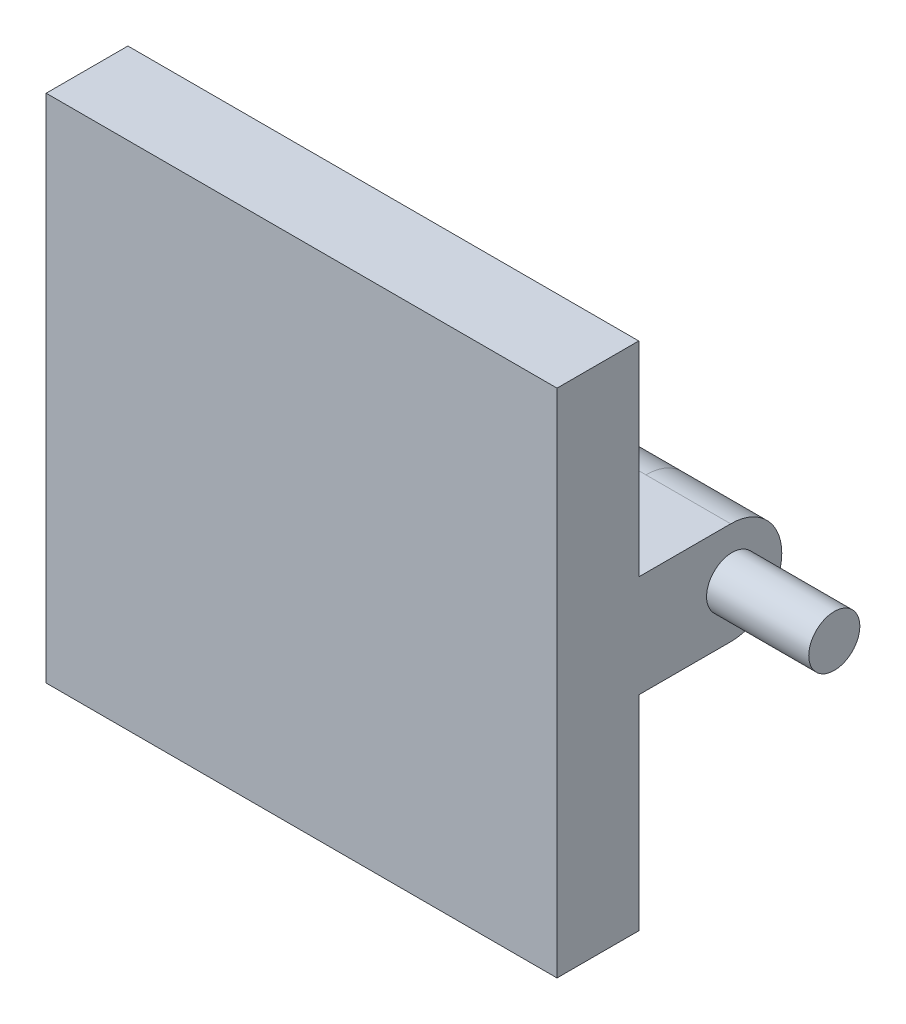
ISO-10303-21;
HEADER;
FILE_DESCRIPTION(('STEP AP214'),'2;1');
FILE_NAME('part.step','',(''),(''),'','','');
FILE_SCHEMA(('AUTOMOTIVE_DESIGN { 1 0 10303 214 1 1 1 1 }'));
ENDSEC;
DATA;
#1=APPLICATION_CONTEXT('core data for automotive mechanical design processes');
#2=APPLICATION_PROTOCOL_DEFINITION('international standard','automotive_design',2000,#1);
#3=PRODUCT_CONTEXT('',#1,'mechanical');
#4=PRODUCT('Part','Part','',(#3));
#5=PRODUCT_RELATED_PRODUCT_CATEGORY('part','',(#4));
#6=PRODUCT_DEFINITION_FORMATION('','',#4);
#7=PRODUCT_DEFINITION_CONTEXT('part definition',#1,'design');
#8=PRODUCT_DEFINITION('design','',#6,#7);
#9=PRODUCT_DEFINITION_SHAPE('','',#8);
#10=(LENGTH_UNIT() NAMED_UNIT(*) SI_UNIT(.MILLI.,.METRE.));
#11=(NAMED_UNIT(*) PLANE_ANGLE_UNIT() SI_UNIT($,.RADIAN.));
#12=(NAMED_UNIT(*) SI_UNIT($,.STERADIAN.) SOLID_ANGLE_UNIT());
#13=UNCERTAINTY_MEASURE_WITH_UNIT(LENGTH_MEASURE(1.E-05),#10,'distance_accuracy_value','');
#14=(GEOMETRIC_REPRESENTATION_CONTEXT(3) GLOBAL_UNCERTAINTY_ASSIGNED_CONTEXT((#13)) GLOBAL_UNIT_ASSIGNED_CONTEXT((#10,
#11,#12)) REPRESENTATION_CONTEXT('',''));
#15=CARTESIAN_POINT('',(0.,0.,0.));
#16=DIRECTION('',(0.,0.,1.));
#17=DIRECTION('',(1.,0.,0.));
#18=AXIS2_PLACEMENT_3D('',#15,#16,#17);
#19=CARTESIAN_POINT('',(0.,0.,170.434));
#20=DIRECTION('',(0.,0.,1.));
#21=DIRECTION('',(1.,0.,0.));
#22=AXIS2_PLACEMENT_3D('',#19,#20,#21);
#23=PLANE('',#22);
#24=DIRECTION('',(1.,0.,0.));
#25=VECTOR('',#24,1.);
#26=CARTESIAN_POINT('',(-21.209,-6.35,170.434));
#27=LINE('',#26,#25);
#28=CARTESIAN_POINT('',(-21.209,-6.35,170.434));
#29=VERTEX_POINT('',#28);
#30=CARTESIAN_POINT('',(31.75,-6.35,170.434));
#31=VERTEX_POINT('',#30);
#32=EDGE_CURVE('E154',#29,#31,#27,.T.);
#33=ORIENTED_EDGE('',*,*,#32,.T.);
#34=DIRECTION('',(0.,1.,0.));
#35=VECTOR('',#34,1.);
#36=CARTESIAN_POINT('',(31.75,-31.75,170.434));
#37=LINE('',#36,#35);
#38=CARTESIAN_POINT('',(31.75,-31.75,170.434));
#39=VERTEX_POINT('',#38);
#40=EDGE_CURVE('E157',#39,#31,#37,.T.);
#41=ORIENTED_EDGE('',*,*,#40,.F.);
#42=DIRECTION('',(1.,0.,0.));
#43=VECTOR('',#42,1.);
#44=CARTESIAN_POINT('',(31.75,-31.75,170.434));
#45=LINE('',#44,#43);
#46=CARTESIAN_POINT('',(-31.75,-31.75,170.434));
#47=VERTEX_POINT('',#46);
#48=EDGE_CURVE('E191',#47,#39,#45,.T.);
#49=ORIENTED_EDGE('',*,*,#48,.F.);
#50=DIRECTION('',(0.,-1.,0.));
#51=VECTOR('',#50,1.);
#52=CARTESIAN_POINT('',(-31.75,-31.75,170.434));
#53=LINE('',#52,#51);
#54=CARTESIAN_POINT('',(-31.75,31.75,170.434));
#55=VERTEX_POINT('',#54);
#56=EDGE_CURVE('E324',#55,#47,#53,.T.);
#57=ORIENTED_EDGE('',*,*,#56,.F.);
#58=DIRECTION('',(-1.,0.,0.));
#59=VECTOR('',#58,1.);
#60=CARTESIAN_POINT('',(31.75,31.75,170.434));
#61=LINE('',#60,#59);
#62=CARTESIAN_POINT('',(31.75,31.75,170.434));
#63=VERTEX_POINT('',#62);
#64=EDGE_CURVE('E184',#63,#55,#61,.T.);
#65=ORIENTED_EDGE('',*,*,#64,.F.);
#66=CARTESIAN_POINT('',(31.75,6.34999999999999,170.434));
#67=VERTEX_POINT('',#66);
#68=EDGE_CURVE('E185',#67,#63,#37,.T.);
#69=ORIENTED_EDGE('',*,*,#68,.F.);
#70=DIRECTION('',(1.,0.,0.));
#71=VECTOR('',#70,1.);
#72=CARTESIAN_POINT('',(-21.209,6.35,170.434));
#73=LINE('',#72,#71);
#74=CARTESIAN_POINT('',(-21.209,6.35,170.434));
#75=VERTEX_POINT('',#74);
#76=EDGE_CURVE('E229',#75,#67,#73,.T.);
#77=ORIENTED_EDGE('',*,*,#76,.F.);
#78=DIRECTION('',(0.,-1.,0.));
#79=VECTOR('',#78,1.);
#80=CARTESIAN_POINT('',(-21.209,6.35,170.434));
#81=LINE('',#80,#79);
#82=EDGE_CURVE('E160',#75,#29,#81,.T.);
#83=ORIENTED_EDGE('',*,*,#82,.T.);
#84=EDGE_LOOP('',(#33,#41,#49,#57,#65,#69,#77,#83));
#85=FACE_BOUND('',#84,.T.);
#86=ADVANCED_FACE('F45',(#85),#23,.F.);
#87=CARTESIAN_POINT('',(-11.049,6.35,165.354));
#88=DIRECTION('',(-1.,0.,0.));
#89=DIRECTION('',(0.,0.,1.));
#90=AXIS2_PLACEMENT_3D('',#87,#88,#89);
#91=PLANE('',#90);
#92=CARTESIAN_POINT('',(-11.049,0.,158.827896988101));
#93=DIRECTION('',(-1.,0.,0.));
#94=DIRECTION('',(0.,0.,1.));
#95=AXIS2_PLACEMENT_3D('',#92,#93,#94);
#96=CIRCLE('',#95,2.921);
#97=CARTESIAN_POINT('',(-11.049,0.,161.748896988101));
#98=VERTEX_POINT('',#97);
#99=EDGE_CURVE('E211',#98,#98,#96,.T.);
#100=ORIENTED_EDGE('',*,*,#99,.T.);
#101=EDGE_LOOP('',(#100));
#102=FACE_BOUND('',#101,.T.);
#103=DIRECTION('',(0.,0.,-1.));
#104=VECTOR('',#103,1.);
#105=CARTESIAN_POINT('',(-11.049,-6.35,165.354));
#106=LINE('',#105,#104);
#107=CARTESIAN_POINT('',(-11.049,-6.35,165.354));
#108=VERTEX_POINT('',#107);
#109=CARTESIAN_POINT('',(-11.049,-6.35,159.004));
#110=VERTEX_POINT('',#109);
#111=EDGE_CURVE('E215',#108,#110,#106,.T.);
#112=ORIENTED_EDGE('',*,*,#111,.T.);
#113=CARTESIAN_POINT('',(-11.049,0.,159.004));
#114=DIRECTION('',(-1.,0.,0.));
#115=DIRECTION('',(0.,0.,1.));
#116=AXIS2_PLACEMENT_3D('',#113,#114,#115);
#117=CIRCLE('',#116,6.35);
#118=CARTESIAN_POINT('',(-11.049,0.,152.654));
#119=VERTEX_POINT('',#118);
#120=EDGE_CURVE('E295',#110,#119,#117,.F.);
#121=ORIENTED_EDGE('',*,*,#120,.T.);
#122=CARTESIAN_POINT('',(-11.049,0.,159.004));
#123=DIRECTION('',(-1.,0.,0.));
#124=DIRECTION('',(0.,0.,1.));
#125=AXIS2_PLACEMENT_3D('',#122,#123,#124);
#126=CIRCLE('',#125,6.35);
#127=CARTESIAN_POINT('',(-11.049,6.35,159.004));
#128=VERTEX_POINT('',#127);
#129=EDGE_CURVE('E292',#119,#128,#126,.F.);
#130=ORIENTED_EDGE('',*,*,#129,.T.);
#131=DIRECTION('',(0.,0.,-1.));
#132=VECTOR('',#131,1.);
#133=CARTESIAN_POINT('',(-11.049,6.35,165.354));
#134=LINE('',#133,#132);
#135=CARTESIAN_POINT('',(-11.049,6.35,165.354));
#136=VERTEX_POINT('',#135);
#137=EDGE_CURVE('E221',#136,#128,#134,.T.);
#138=ORIENTED_EDGE('',*,*,#137,.F.);
#139=DIRECTION('',(0.,-1.,0.));
#140=VECTOR('',#139,1.);
#141=CARTESIAN_POINT('',(-11.049,6.35,165.354));
#142=LINE('',#141,#140);
#143=EDGE_CURVE('E251',#136,#108,#142,.T.);
#144=ORIENTED_EDGE('',*,*,#143,.T.);
#145=EDGE_LOOP('',(#112,#121,#130,#138,#144));
#146=FACE_BOUND('',#145,.T.);
#147=ADVANCED_FACE('F370',(#102,#146),#91,.F.);
#148=CARTESIAN_POINT('',(-21.209,6.35,152.654));
#149=DIRECTION('',(1.,0.,0.));
#150=DIRECTION('',(0.,0.,-1.));
#151=AXIS2_PLACEMENT_3D('',#148,#149,#150);
#152=PLANE('',#151);
#153=CARTESIAN_POINT('',(-21.209,0.,159.004));
#154=DIRECTION('',(1.,0.,0.));
#155=DIRECTION('',(0.,0.,-1.));
#156=AXIS2_PLACEMENT_3D('',#153,#154,#155);
#157=CIRCLE('',#156,6.35);
#158=CARTESIAN_POINT('',(-21.209,6.35,159.004));
#159=VERTEX_POINT('',#158);
#160=CARTESIAN_POINT('',(-21.209,0.,152.654));
#161=VERTEX_POINT('',#160);
#162=EDGE_CURVE('E286',#159,#161,#157,.F.);
#163=ORIENTED_EDGE('',*,*,#162,.T.);
#164=CARTESIAN_POINT('',(-21.209,0.,159.004));
#165=DIRECTION('',(1.,0.,0.));
#166=DIRECTION('',(0.,0.,-1.));
#167=AXIS2_PLACEMENT_3D('',#164,#165,#166);
#168=CIRCLE('',#167,6.35);
#169=CARTESIAN_POINT('',(-21.209,-6.35,159.004));
#170=VERTEX_POINT('',#169);
#171=EDGE_CURVE('E289',#161,#170,#168,.F.);
#172=ORIENTED_EDGE('',*,*,#171,.T.);
#173=DIRECTION('',(0.,0.,1.));
#174=VECTOR('',#173,1.);
#175=CARTESIAN_POINT('',(-21.209,-6.35,152.654));
#176=LINE('',#175,#174);
#177=EDGE_CURVE('E166',#170,#29,#176,.T.);
#178=ORIENTED_EDGE('',*,*,#177,.T.);
#179=ORIENTED_EDGE('',*,*,#82,.F.);
#180=DIRECTION('',(0.,0.,1.));
#181=VECTOR('',#180,1.);
#182=CARTESIAN_POINT('',(-21.209,6.35,152.654));
#183=LINE('',#182,#181);
#184=EDGE_CURVE('E226',#159,#75,#183,.T.);
#185=ORIENTED_EDGE('',*,*,#184,.F.);
#186=EDGE_LOOP('',(#163,#172,#178,#179,#185));
#187=FACE_BOUND('',#186,.T.);
#188=ADVANCED_FACE('F361',(#187),#152,.F.);
#189=CARTESIAN_POINT('',(11.049,6.35,165.354));
#190=DIRECTION('',(1.,0.,0.));
#191=DIRECTION('',(0.,0.,-1.));
#192=AXIS2_PLACEMENT_3D('',#189,#190,#191);
#193=PLANE('',#192);
#194=CARTESIAN_POINT('',(11.049,0.,158.827896988101));
#195=DIRECTION('',(1.,0.,0.));
#196=DIRECTION('',(0.,0.,-1.));
#197=AXIS2_PLACEMENT_3D('',#194,#195,#196);
#198=CIRCLE('',#197,2.921);
#199=CARTESIAN_POINT('',(11.049,0.,155.906896988101));
#200=VERTEX_POINT('',#199);
#201=EDGE_CURVE('E216',#200,#200,#198,.T.);
#202=ORIENTED_EDGE('',*,*,#201,.T.);
#203=EDGE_LOOP('',(#202));
#204=FACE_BOUND('',#203,.T.);
#205=CARTESIAN_POINT('',(11.049,0.,159.004));
#206=DIRECTION('',(1.,0.,0.));
#207=DIRECTION('',(0.,0.,-1.));
#208=AXIS2_PLACEMENT_3D('',#205,#206,#207);
#209=CIRCLE('',#208,6.35);
#210=CARTESIAN_POINT('',(11.049,6.35,159.004));
#211=VERTEX_POINT('',#210);
#212=CARTESIAN_POINT('',(11.049,0.,152.654));
#213=VERTEX_POINT('',#212);
#214=EDGE_CURVE('E255',#211,#213,#209,.F.);
#215=ORIENTED_EDGE('',*,*,#214,.T.);
#216=CARTESIAN_POINT('',(11.049,0.,159.004));
#217=DIRECTION('',(1.,0.,0.));
#218=DIRECTION('',(0.,0.,-1.));
#219=AXIS2_PLACEMENT_3D('',#216,#217,#218);
#220=CIRCLE('',#219,6.35);
#221=CARTESIAN_POINT('',(11.049,-6.35,159.004));
#222=VERTEX_POINT('',#221);
#223=EDGE_CURVE('E262',#213,#222,#220,.F.);
#224=ORIENTED_EDGE('',*,*,#223,.T.);
#225=DIRECTION('',(0.,0.,1.));
#226=VECTOR('',#225,1.);
#227=CARTESIAN_POINT('',(11.049,-6.35,165.354));
#228=LINE('',#227,#226);
#229=CARTESIAN_POINT('',(11.049,-6.35,165.354));
#230=VERTEX_POINT('',#229);
#231=EDGE_CURVE('E165',#222,#230,#228,.T.);
#232=ORIENTED_EDGE('',*,*,#231,.T.);
#233=DIRECTION('',(0.,-1.,0.));
#234=VECTOR('',#233,1.);
#235=CARTESIAN_POINT('',(11.049,6.35,165.354));
#236=LINE('',#235,#234);
#237=CARTESIAN_POINT('',(11.049,6.35,165.354));
#238=VERTEX_POINT('',#237);
#239=EDGE_CURVE('E236',#238,#230,#236,.T.);
#240=ORIENTED_EDGE('',*,*,#239,.F.);
#241=DIRECTION('',(0.,0.,1.));
#242=VECTOR('',#241,1.);
#243=CARTESIAN_POINT('',(11.049,6.35,165.354));
#244=LINE('',#243,#242);
#245=EDGE_CURVE('E233',#211,#238,#244,.T.);
#246=ORIENTED_EDGE('',*,*,#245,.F.);
#247=EDGE_LOOP('',(#215,#224,#232,#240,#246));
#248=FACE_BOUND('',#247,.T.);
#249=ADVANCED_FACE('F415',(#204,#248),#193,.F.);
#250=CARTESIAN_POINT('',(0.,6.35,165.354));
#251=DIRECTION('',(0.,0.,1.));
#252=DIRECTION('',(1.,0.,0.));
#253=AXIS2_PLACEMENT_3D('',#250,#251,#252);
#254=PLANE('',#253);
#255=DIRECTION('',(-1.,0.,0.));
#256=VECTOR('',#255,1.);
#257=CARTESIAN_POINT('',(0.,-6.35,165.354));
#258=LINE('',#257,#256);
#259=EDGE_CURVE('E222',#230,#108,#258,.T.);
#260=ORIENTED_EDGE('',*,*,#259,.T.);
#261=ORIENTED_EDGE('',*,*,#143,.F.);
#262=DIRECTION('',(-1.,0.,0.));
#263=VECTOR('',#262,1.);
#264=CARTESIAN_POINT('',(0.,6.35,165.354));
#265=LINE('',#264,#263);
#266=EDGE_CURVE('E217',#238,#136,#265,.T.);
#267=ORIENTED_EDGE('',*,*,#266,.F.);
#268=ORIENTED_EDGE('',*,*,#239,.T.);
#269=EDGE_LOOP('',(#260,#261,#267,#268));
#270=FACE_BOUND('',#269,.T.);
#271=ADVANCED_FACE('F410',(#270),#254,.F.);
#272=CARTESIAN_POINT('',(0.,6.35,0.));
#273=DIRECTION('',(0.,-1.,0.));
#274=DIRECTION('',(0.,0.,-1.));
#275=AXIS2_PLACEMENT_3D('',#272,#273,#274);
#276=PLANE('',#275);
#277=DIRECTION('',(0.,0.,1.));
#278=VECTOR('',#277,1.);
#279=CARTESIAN_POINT('',(31.75,6.35,170.434));
#280=LINE('',#279,#278);
#281=CARTESIAN_POINT('',(31.75,6.35,159.004));
#282=VERTEX_POINT('',#281);
#283=EDGE_CURVE('E175',#282,#67,#280,.T.);
#284=ORIENTED_EDGE('',*,*,#283,.F.);
#285=DIRECTION('',(-1.,0.,0.));
#286=VECTOR('',#285,1.);
#287=CARTESIAN_POINT('',(0.,6.35,159.004));
#288=LINE('',#287,#286);
#289=CARTESIAN_POINT('',(21.209,6.35,159.004));
#290=VERTEX_POINT('',#289);
#291=EDGE_CURVE('E54',#282,#290,#288,.T.);
#292=ORIENTED_EDGE('',*,*,#291,.T.);
#293=DIRECTION('',(-1.,0.,0.));
#294=VECTOR('',#293,1.);
#295=CARTESIAN_POINT('',(0.,6.35,159.004));
#296=LINE('',#295,#294);
#297=EDGE_CURVE('E283',#290,#211,#296,.T.);
#298=ORIENTED_EDGE('',*,*,#297,.T.);
#299=ORIENTED_EDGE('',*,*,#245,.T.);
#300=ORIENTED_EDGE('',*,*,#266,.T.);
#301=ORIENTED_EDGE('',*,*,#137,.T.);
#302=DIRECTION('',(-1.,0.,0.));
#303=VECTOR('',#302,1.);
#304=CARTESIAN_POINT('',(0.,6.35,159.004));
#305=LINE('',#304,#303);
#306=EDGE_CURVE('E280',#128,#159,#305,.T.);
#307=ORIENTED_EDGE('',*,*,#306,.T.);
#308=ORIENTED_EDGE('',*,*,#184,.T.);
#309=ORIENTED_EDGE('',*,*,#76,.T.);
#310=EDGE_LOOP('',(#284,#292,#298,#299,#300,#301,#307,#308,#309));
#311=FACE_BOUND('',#310,.T.);
#312=ADVANCED_FACE('F356',(#311),#276,.F.);
#313=CARTESIAN_POINT('',(0.,-6.35,0.));
#314=DIRECTION('',(0.,-1.,0.));
#315=DIRECTION('',(0.,0.,-1.));
#316=AXIS2_PLACEMENT_3D('',#313,#314,#315);
#317=PLANE('',#316);
#318=DIRECTION('',(-1.,0.,0.));
#319=VECTOR('',#318,1.);
#320=CARTESIAN_POINT('',(21.209,-6.35,159.004));
#321=LINE('',#320,#319);
#322=CARTESIAN_POINT('',(21.209,-6.35,159.004));
#323=VERTEX_POINT('',#322);
#324=EDGE_CURVE('E269',#222,#323,#321,.F.);
#325=ORIENTED_EDGE('',*,*,#324,.T.);
#326=DIRECTION('',(-1.,0.,0.));
#327=VECTOR('',#326,1.);
#328=CARTESIAN_POINT('',(31.75,-6.35,159.004));
#329=LINE('',#328,#327);
#330=CARTESIAN_POINT('',(31.75,-6.35,159.004));
#331=VERTEX_POINT('',#330);
#332=EDGE_CURVE('E173',#323,#331,#329,.F.);
#333=ORIENTED_EDGE('',*,*,#332,.T.);
#334=DIRECTION('',(0.,0.,-1.));
#335=VECTOR('',#334,1.);
#336=CARTESIAN_POINT('',(31.75,-6.35,170.434));
#337=LINE('',#336,#335);
#338=EDGE_CURVE('E169',#31,#331,#337,.T.);
#339=ORIENTED_EDGE('',*,*,#338,.F.);
#340=ORIENTED_EDGE('',*,*,#32,.F.);
#341=ORIENTED_EDGE('',*,*,#177,.F.);
#342=DIRECTION('',(-1.,0.,0.));
#343=VECTOR('',#342,1.);
#344=CARTESIAN_POINT('',(-11.049,-6.35,159.004));
#345=LINE('',#344,#343);
#346=EDGE_CURVE('E265',#170,#110,#345,.F.);
#347=ORIENTED_EDGE('',*,*,#346,.T.);
#348=ORIENTED_EDGE('',*,*,#111,.F.);
#349=ORIENTED_EDGE('',*,*,#259,.F.);
#350=ORIENTED_EDGE('',*,*,#231,.F.);
#351=EDGE_LOOP('',(#325,#333,#339,#340,#341,#347,#348,#349,#350));
#352=FACE_BOUND('',#351,.T.);
#353=ADVANCED_FACE('F171',(#352),#317,.T.);
#354=CARTESIAN_POINT('',(14.605,0.,158.827896988101));
#355=DIRECTION('',(-1.,0.,0.));
#356=DIRECTION('',(0.,0.,1.));
#357=AXIS2_PLACEMENT_3D('',#354,#355,#356);
#358=CYLINDRICAL_SURFACE('',#357,2.921);
#359=ORIENTED_EDGE('',*,*,#201,.F.);
#360=EDGE_LOOP('',(#359));
#361=FACE_BOUND('',#360,.T.);
#362=ORIENTED_EDGE('',*,*,#99,.F.);
#363=EDGE_LOOP('',(#362));
#364=FACE_BOUND('',#363,.T.);
#365=ADVANCED_FACE('F406',(#361,#364),#358,.T.);
#366=CARTESIAN_POINT('',(0.,0.,159.004));
#367=DIRECTION('',(-1.,0.,0.));
#368=DIRECTION('',(0.,0.,1.));
#369=AXIS2_PLACEMENT_3D('',#366,#367,#368);
#370=CYLINDRICAL_SURFACE('',#369,6.35);
#371=ORIENTED_EDGE('',*,*,#297,.F.);
#372=CARTESIAN_POINT('',(21.209,0.,159.004));
#373=DIRECTION('',(-1.,0.,0.));
#374=DIRECTION('',(0.,0.,1.));
#375=AXIS2_PLACEMENT_3D('',#372,#373,#374);
#376=CIRCLE('',#375,6.35);
#377=CARTESIAN_POINT('',(21.209,0.,152.654));
#378=VERTEX_POINT('',#377);
#379=EDGE_CURVE('E272',#378,#290,#376,.F.);
#380=ORIENTED_EDGE('',*,*,#379,.F.);
#381=DIRECTION('',(-1.,0.,0.));
#382=VECTOR('',#381,1.);
#383=CARTESIAN_POINT('',(11.049,0.,152.654));
#384=LINE('',#383,#382);
#385=EDGE_CURVE('E259',#213,#378,#384,.F.);
#386=ORIENTED_EDGE('',*,*,#385,.F.);
#387=ORIENTED_EDGE('',*,*,#214,.F.);
#388=EDGE_LOOP('',(#371,#380,#386,#387));
#389=FACE_BOUND('',#388,.T.);
#390=ADVANCED_FACE('F382',(#389),#370,.T.);
#391=CARTESIAN_POINT('',(11.049,0.,159.004));
#392=DIRECTION('',(1.,0.,0.));
#393=DIRECTION('',(0.,0.,-1.));
#394=AXIS2_PLACEMENT_3D('',#391,#392,#393);
#395=CYLINDRICAL_SURFACE('',#394,6.35);
#396=CARTESIAN_POINT('',(21.209,0.,159.004));
#397=DIRECTION('',(-1.,0.,0.));
#398=DIRECTION('',(0.,0.,1.));
#399=AXIS2_PLACEMENT_3D('',#396,#397,#398);
#400=CIRCLE('',#399,6.35);
#401=EDGE_CURVE('E276',#323,#378,#400,.F.);
#402=ORIENTED_EDGE('',*,*,#401,.F.);
#403=ORIENTED_EDGE('',*,*,#324,.F.);
#404=ORIENTED_EDGE('',*,*,#223,.F.);
#405=ORIENTED_EDGE('',*,*,#385,.T.);
#406=EDGE_LOOP('',(#402,#403,#404,#405));
#407=FACE_BOUND('',#406,.T.);
#408=ADVANCED_FACE('F374',(#407),#395,.T.);
#409=CARTESIAN_POINT('',(0.,0.,159.004));
#410=DIRECTION('',(-1.,0.,0.));
#411=DIRECTION('',(0.,0.,1.));
#412=AXIS2_PLACEMENT_3D('',#409,#410,#411);
#413=CYLINDRICAL_SURFACE('',#412,6.35);
#414=ORIENTED_EDGE('',*,*,#306,.F.);
#415=ORIENTED_EDGE('',*,*,#129,.F.);
#416=DIRECTION('',(-1.,0.,0.));
#417=VECTOR('',#416,1.);
#418=CARTESIAN_POINT('',(-11.049,0.,152.654));
#419=LINE('',#418,#417);
#420=EDGE_CURVE('E210',#161,#119,#419,.F.);
#421=ORIENTED_EDGE('',*,*,#420,.F.);
#422=ORIENTED_EDGE('',*,*,#162,.F.);
#423=EDGE_LOOP('',(#414,#415,#421,#422));
#424=FACE_BOUND('',#423,.T.);
#425=ADVANCED_FACE('F372',(#424),#413,.T.);
#426=CARTESIAN_POINT('',(-11.049,0.,159.004));
#427=DIRECTION('',(1.,0.,0.));
#428=DIRECTION('',(0.,0.,-1.));
#429=AXIS2_PLACEMENT_3D('',#426,#427,#428);
#430=CYLINDRICAL_SURFACE('',#429,6.35);
#431=ORIENTED_EDGE('',*,*,#120,.F.);
#432=ORIENTED_EDGE('',*,*,#346,.F.);
#433=ORIENTED_EDGE('',*,*,#171,.F.);
#434=ORIENTED_EDGE('',*,*,#420,.T.);
#435=EDGE_LOOP('',(#431,#432,#433,#434));
#436=FACE_BOUND('',#435,.T.);
#437=ADVANCED_FACE('F366',(#436),#430,.T.);
#438=CARTESIAN_POINT('',(-31.75,-31.75,180.594));
#439=DIRECTION('',(1.,0.,0.));
#440=DIRECTION('',(0.,0.,-1.));
#441=AXIS2_PLACEMENT_3D('',#438,#439,#440);
#442=PLANE('',#441);
#443=ORIENTED_EDGE('',*,*,#56,.T.);
#444=DIRECTION('',(0.,0.,-1.));
#445=VECTOR('',#444,1.);
#446=CARTESIAN_POINT('',(-31.75,-31.75,180.594));
#447=LINE('',#446,#445);
#448=CARTESIAN_POINT('',(-31.75,-31.75,180.594));
#449=VERTEX_POINT('',#448);
#450=EDGE_CURVE('E206',#449,#47,#447,.T.);
#451=ORIENTED_EDGE('',*,*,#450,.F.);
#452=DIRECTION('',(0.,-1.,0.));
#453=VECTOR('',#452,1.);
#454=CARTESIAN_POINT('',(-31.75,-31.75,180.594));
#455=LINE('',#454,#453);
#456=CARTESIAN_POINT('',(-31.75,31.75,180.594));
#457=VERTEX_POINT('',#456);
#458=EDGE_CURVE('E189',#457,#449,#455,.T.);
#459=ORIENTED_EDGE('',*,*,#458,.F.);
#460=DIRECTION('',(0.,0.,-1.));
#461=VECTOR('',#460,1.);
#462=CARTESIAN_POINT('',(-31.75,31.75,180.594));
#463=LINE('',#462,#461);
#464=EDGE_CURVE('E195',#457,#55,#463,.T.);
#465=ORIENTED_EDGE('',*,*,#464,.T.);
#466=EDGE_LOOP('',(#443,#451,#459,#465));
#467=FACE_BOUND('',#466,.T.);
#468=ADVANCED_FACE('F351',(#467),#442,.F.);
#469=CARTESIAN_POINT('',(31.75,-31.75,180.594));
#470=DIRECTION('',(0.,1.,0.));
#471=DIRECTION('',(-1.,0.,0.));
#472=AXIS2_PLACEMENT_3D('',#469,#470,#471);
#473=PLANE('',#472);
#474=ORIENTED_EDGE('',*,*,#48,.T.);
#475=DIRECTION('',(0.,0.,-1.));
#476=VECTOR('',#475,1.);
#477=CARTESIAN_POINT('',(31.75,-31.75,180.594));
#478=LINE('',#477,#476);
#479=CARTESIAN_POINT('',(31.75,-31.75,180.594));
#480=VERTEX_POINT('',#479);
#481=EDGE_CURVE('E182',#480,#39,#478,.T.);
#482=ORIENTED_EDGE('',*,*,#481,.F.);
#483=DIRECTION('',(1.,0.,0.));
#484=VECTOR('',#483,1.);
#485=CARTESIAN_POINT('',(31.75,-31.75,180.594));
#486=LINE('',#485,#484);
#487=EDGE_CURVE('E328',#449,#480,#486,.T.);
#488=ORIENTED_EDGE('',*,*,#487,.F.);
#489=ORIENTED_EDGE('',*,*,#450,.T.);
#490=EDGE_LOOP('',(#474,#482,#488,#489));
#491=FACE_BOUND('',#490,.T.);
#492=ADVANCED_FACE('F342',(#491),#473,.F.);
#493=CARTESIAN_POINT('',(31.75,-31.75,180.594));
#494=DIRECTION('',(-1.,0.,0.));
#495=DIRECTION('',(0.,0.,1.));
#496=AXIS2_PLACEMENT_3D('',#493,#494,#495);
#497=PLANE('',#496);
#498=CARTESIAN_POINT('',(31.75,0.,158.827896988101));
#499=DIRECTION('',(-1.,0.,0.));
#500=DIRECTION('',(0.,0.,1.));
#501=AXIS2_PLACEMENT_3D('',#498,#499,#500);
#502=CIRCLE('',#501,3.175);
#503=CARTESIAN_POINT('',(31.75,0.,162.002896988101));
#504=VERTEX_POINT('',#503);
#505=EDGE_CURVE('E11',#504,#504,#502,.F.);
#506=ORIENTED_EDGE('',*,*,#505,.F.);
#507=EDGE_LOOP('',(#506));
#508=FACE_BOUND('',#507,.T.);
#509=ORIENTED_EDGE('',*,*,#338,.T.);
#510=CARTESIAN_POINT('',(31.75,0.,159.004));
#511=DIRECTION('',(-1.,0.,0.));
#512=DIRECTION('',(0.,0.,1.));
#513=AXIS2_PLACEMENT_3D('',#510,#511,#512);
#514=CIRCLE('',#513,6.35);
#515=CARTESIAN_POINT('',(31.75,0.,152.654));
#516=VERTEX_POINT('',#515);
#517=EDGE_CURVE('E66',#331,#516,#514,.F.);
#518=ORIENTED_EDGE('',*,*,#517,.T.);
#519=CARTESIAN_POINT('',(31.75,0.,159.004));
#520=DIRECTION('',(-1.,0.,0.));
#521=DIRECTION('',(0.,0.,1.));
#522=AXIS2_PLACEMENT_3D('',#519,#520,#521);
#523=CIRCLE('',#522,6.35);
#524=EDGE_CURVE('E61',#516,#282,#523,.F.);
#525=ORIENTED_EDGE('',*,*,#524,.T.);
#526=ORIENTED_EDGE('',*,*,#283,.T.);
#527=ORIENTED_EDGE('',*,*,#68,.T.);
#528=DIRECTION('',(0.,0.,-1.));
#529=VECTOR('',#528,1.);
#530=CARTESIAN_POINT('',(31.75,31.75,180.594));
#531=LINE('',#530,#529);
#532=CARTESIAN_POINT('',(31.75,31.75,180.594));
#533=VERTEX_POINT('',#532);
#534=EDGE_CURVE('E199',#533,#63,#531,.T.);
#535=ORIENTED_EDGE('',*,*,#534,.F.);
#536=DIRECTION('',(0.,1.,0.));
#537=VECTOR('',#536,1.);
#538=CARTESIAN_POINT('',(31.75,-31.75,180.594));
#539=LINE('',#538,#537);
#540=EDGE_CURVE('E331',#480,#533,#539,.T.);
#541=ORIENTED_EDGE('',*,*,#540,.F.);
#542=ORIENTED_EDGE('',*,*,#481,.T.);
#543=ORIENTED_EDGE('',*,*,#40,.T.);
#544=EDGE_LOOP('',(#509,#518,#525,#526,#527,#535,#541,#542,#543));
#545=FACE_BOUND('',#544,.T.);
#546=ADVANCED_FACE('F179',(#508,#545),#497,.F.);
#547=CARTESIAN_POINT('',(31.75,31.75,180.594));
#548=DIRECTION('',(0.,-1.,0.));
#549=DIRECTION('',(0.,0.,-1.));
#550=AXIS2_PLACEMENT_3D('',#547,#548,#549);
#551=PLANE('',#550);
#552=ORIENTED_EDGE('',*,*,#64,.T.);
#553=ORIENTED_EDGE('',*,*,#464,.F.);
#554=DIRECTION('',(-1.,0.,0.));
#555=VECTOR('',#554,1.);
#556=CARTESIAN_POINT('',(31.75,31.75,180.594));
#557=LINE('',#556,#555);
#558=EDGE_CURVE('E200',#533,#457,#557,.T.);
#559=ORIENTED_EDGE('',*,*,#558,.F.);
#560=ORIENTED_EDGE('',*,*,#534,.T.);
#561=EDGE_LOOP('',(#552,#553,#559,#560));
#562=FACE_BOUND('',#561,.T.);
#563=ADVANCED_FACE('F347',(#562),#551,.F.);
#564=CARTESIAN_POINT('',(0.,0.,180.594));
#565=DIRECTION('',(0.,0.,1.));
#566=DIRECTION('',(1.,0.,0.));
#567=AXIS2_PLACEMENT_3D('',#564,#565,#566);
#568=PLANE('',#567);
#569=ORIENTED_EDGE('',*,*,#458,.T.);
#570=ORIENTED_EDGE('',*,*,#487,.T.);
#571=ORIENTED_EDGE('',*,*,#540,.T.);
#572=ORIENTED_EDGE('',*,*,#558,.T.);
#573=EDGE_LOOP('',(#569,#570,#571,#572));
#574=FACE_BOUND('',#573,.T.);
#575=ADVANCED_FACE('F353',(#574),#568,.T.);
#576=CARTESIAN_POINT('',(0.,0.,159.004));
#577=DIRECTION('',(-1.,0.,0.));
#578=DIRECTION('',(0.,0.,1.));
#579=AXIS2_PLACEMENT_3D('',#576,#577,#578);
#580=CYLINDRICAL_SURFACE('',#579,6.35);
#581=ORIENTED_EDGE('',*,*,#291,.F.);
#582=ORIENTED_EDGE('',*,*,#524,.F.);
#583=DIRECTION('',(-1.,0.,0.));
#584=VECTOR('',#583,1.);
#585=CARTESIAN_POINT('',(31.75,0.,152.654));
#586=LINE('',#585,#584);
#587=EDGE_CURVE('E176',#378,#516,#586,.F.);
#588=ORIENTED_EDGE('',*,*,#587,.F.);
#589=ORIENTED_EDGE('',*,*,#379,.T.);
#590=EDGE_LOOP('',(#581,#582,#588,#589));
#591=FACE_BOUND('',#590,.T.);
#592=ADVANCED_FACE('F47',(#591),#580,.T.);
#593=CARTESIAN_POINT('',(31.75,0.,159.004));
#594=DIRECTION('',(1.,0.,0.));
#595=DIRECTION('',(0.,0.,-1.));
#596=AXIS2_PLACEMENT_3D('',#593,#594,#595);
#597=CYLINDRICAL_SURFACE('',#596,6.35);
#598=ORIENTED_EDGE('',*,*,#517,.F.);
#599=ORIENTED_EDGE('',*,*,#332,.F.);
#600=ORIENTED_EDGE('',*,*,#401,.T.);
#601=ORIENTED_EDGE('',*,*,#587,.T.);
#602=EDGE_LOOP('',(#598,#599,#600,#601));
#603=FACE_BOUND('',#602,.T.);
#604=ADVANCED_FACE('F430',(#603),#597,.T.);
#605=CARTESIAN_POINT('',(44.45,0.,158.827896988101));
#606=DIRECTION('',(-1.,0.,0.));
#607=DIRECTION('',(0.,0.,1.));
#608=AXIS2_PLACEMENT_3D('',#605,#606,#607);
#609=CYLINDRICAL_SURFACE('',#608,3.175);
#610=CARTESIAN_POINT('',(44.45,0.,158.827896988101));
#611=DIRECTION('',(1.,0.,0.));
#612=DIRECTION('',(0.,0.,-1.));
#613=AXIS2_PLACEMENT_3D('',#610,#611,#612);
#614=CIRCLE('',#613,3.175);
#615=CARTESIAN_POINT('',(44.45,0.,155.652896988101));
#616=VERTEX_POINT('',#615);
#617=EDGE_CURVE('E313',#616,#616,#614,.T.);
#618=ORIENTED_EDGE('',*,*,#617,.F.);
#619=EDGE_LOOP('',(#618));
#620=FACE_BOUND('',#619,.T.);
#621=ORIENTED_EDGE('',*,*,#505,.T.);
#622=EDGE_LOOP('',(#621));
#623=FACE_BOUND('',#622,.T.);
#624=ADVANCED_FACE('F440',(#620,#623),#609,.T.);
#625=CARTESIAN_POINT('',(44.45,0.,158.827896988101));
#626=DIRECTION('',(1.,0.,0.));
#627=DIRECTION('',(0.,0.,-1.));
#628=AXIS2_PLACEMENT_3D('',#625,#626,#627);
#629=PLANE('',#628);
#630=ORIENTED_EDGE('',*,*,#617,.T.);
#631=EDGE_LOOP('',(#630));
#632=FACE_BOUND('',#631,.T.);
#633=ADVANCED_FACE('F445',(#632),#629,.T.);
#634=CLOSED_SHELL('',(#86,#147,#188,#249,#271,#312,#353,#365,#390,#408,#425,#437,#468,#492,#546,
#563,#575,#592,#604,#624,#633));
#635=MANIFOLD_SOLID_BREP('B2',#634);
#636=ADVANCED_BREP_SHAPE_REPRESENTATION('',(#18,#635),#14);
#637=SHAPE_DEFINITION_REPRESENTATION(#9,#636);
ENDSEC;
END-ISO-10303-21;
